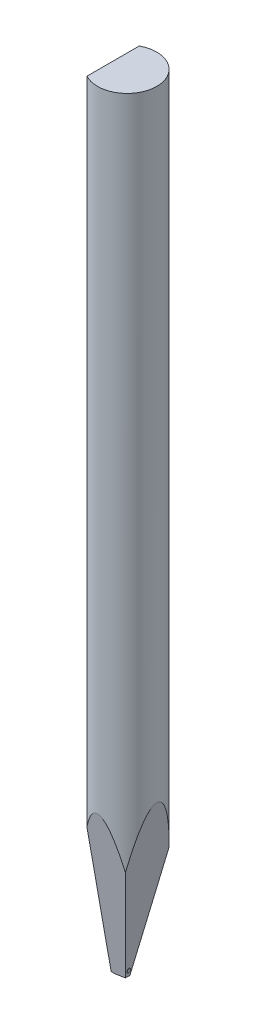
ISO-10303-21;
HEADER;
FILE_DESCRIPTION(('STEP AP214'),'2;1');
FILE_NAME('part.step','',(''),(''),'','','');
FILE_SCHEMA(('AUTOMOTIVE_DESIGN { 1 0 10303 214 1 1 1 1 }'));
ENDSEC;
DATA;
#1=APPLICATION_CONTEXT('core data for automotive mechanical design processes');
#2=APPLICATION_PROTOCOL_DEFINITION('international standard','automotive_design',2000,#1);
#3=PRODUCT_CONTEXT('',#1,'mechanical');
#4=PRODUCT('Part','Part','',(#3));
#5=PRODUCT_RELATED_PRODUCT_CATEGORY('part','',(#4));
#6=PRODUCT_DEFINITION_FORMATION('','',#4);
#7=PRODUCT_DEFINITION_CONTEXT('part definition',#1,'design');
#8=PRODUCT_DEFINITION('design','',#6,#7);
#9=PRODUCT_DEFINITION_SHAPE('','',#8);
#10=(LENGTH_UNIT() NAMED_UNIT(*) SI_UNIT(.MILLI.,.METRE.));
#11=(NAMED_UNIT(*) PLANE_ANGLE_UNIT() SI_UNIT($,.RADIAN.));
#12=(NAMED_UNIT(*) SI_UNIT($,.STERADIAN.) SOLID_ANGLE_UNIT());
#13=UNCERTAINTY_MEASURE_WITH_UNIT(LENGTH_MEASURE(1.E-05),#10,'distance_accuracy_value','');
#14=(GEOMETRIC_REPRESENTATION_CONTEXT(3) GLOBAL_UNCERTAINTY_ASSIGNED_CONTEXT((#13)) GLOBAL_UNIT_ASSIGNED_CONTEXT((#10,
#11,#12)) REPRESENTATION_CONTEXT('',''));
#15=CARTESIAN_POINT('',(0.,0.,0.));
#16=DIRECTION('',(0.,0.,1.));
#17=DIRECTION('',(1.,0.,0.));
#18=AXIS2_PLACEMENT_3D('',#15,#16,#17);
#19=CARTESIAN_POINT('',(-0.35179,0.02413,-0.697645113220181));
#20=DIRECTION('',(0.,0.,-1.));
#21=DIRECTION('',(-1.,0.,0.));
#22=AXIS2_PLACEMENT_3D('',#19,#20,#21);
#23=CYLINDRICAL_SURFACE('',#22,0.02413);
#24=DIRECTION('',(0.,0.,1.));
#25=VECTOR('',#24,1.);
#26=CARTESIAN_POINT('',(-0.35179,0.,-0.697645113220181));
#27=LINE('',#26,#25);
#28=CARTESIAN_POINT('',(-0.351790000000001,0.,-0.0355373141922684));
#29=VERTEX_POINT('',#28);
#30=CARTESIAN_POINT('',(-0.351790000000001,0.,-0.0508));
#31=VERTEX_POINT('',#30);
#32=EDGE_CURVE('E268',#29,#31,#27,.F.);
#33=ORIENTED_EDGE('',*,*,#32,.F.);
#34=CARTESIAN_POINT('',(-0.351790000000659,0.,0.0355373141922685));
#35=CARTESIAN_POINT('',(-0.355439384782997,0.,0.0355448754797007));
#36=CARTESIAN_POINT('',(-0.358294431690221,0.000735009319129566,0.0328897702512951));
#37=CARTESIAN_POINT('',(-0.363332226937785,0.00276624054883062,0.027243529224967));
#38=CARTESIAN_POINT('',(-0.365669914625181,0.00414391785908221,0.0239802570416559));
#39=CARTESIAN_POINT('',(-0.370318278213299,0.00835665489515854,0.0173280439032284));
#40=CARTESIAN_POINT('',(-0.372697992437492,0.0113759111488522,0.0139008125188561));
#41=CARTESIAN_POINT('',(-0.375773637558285,0.019170558533262,0.00698806495705653));
#42=CARTESIAN_POINT('',(-0.375919999997032,0.0241261624167635,0.00351378677860995));
#43=CARTESIAN_POINT('',(-0.375920000002953,0.0241338001705575,-0.00344714356347953));
#44=CARTESIAN_POINT('',(-0.375775830039886,0.0191733950297102,-0.00697985321022779));
#45=CARTESIAN_POINT('',(-0.372691584248382,0.0113623944515196,-0.0139527446694006));
#46=CARTESIAN_POINT('',(-0.370302827351457,0.00833894476345204,-0.017392282784283));
#47=CARTESIAN_POINT('',(-0.36565390830275,0.0041331440320866,-0.024020652659714));
#48=CARTESIAN_POINT('',(-0.363329174051964,0.00276466571011306,-0.0272501183872912));
#49=CARTESIAN_POINT('',(-0.358292223960195,0.000734463445101154,-0.0328915850521503));
#50=CARTESIAN_POINT('',(-0.35541937367538,0.,-0.0355460604902777));
#51=CARTESIAN_POINT('',(-0.35179,0.,-0.0355373141922684));
#52=(BOUNDED_CURVE() B_SPLINE_CURVE(3,(#34,#35,#36,#37,#38,#39,#40,#41,#42,#43,#44,#45,#46,#47,
#48,#49,#50,#51),.UNSPECIFIED.,.F.,.F.) B_SPLINE_CURVE_WITH_KNOTS((4,2,2,2,2,2,2,2,4),(0.,
1.01740372471117E-05,2.03480744942226E-05,3.05221117413334E-05,4.06961489884443E-05,
5.08701862355551E-05,6.1044223482666E-05,7.12182607297768E-05,8.13922979768877E-05),
.UNSPECIFIED.) CURVE() GEOMETRIC_REPRESENTATION_ITEM() RATIONAL_B_SPLINE_CURVE((1.,1.,1.,1.,1.,
1.,1.,1.,1.,1.,1.,1.,1.,1.,1.,1.,1.,1.)) REPRESENTATION_ITEM(''));
#53=CARTESIAN_POINT('',(-0.37592,0.02413,2.93448059982297E-05));
#54=VERTEX_POINT('',#53);
#55=EDGE_CURVE('E60',#29,#54,#52,.F.);
#56=ORIENTED_EDGE('',*,*,#55,.T.);
#57=DIRECTION('',(0.,0.,1.));
#58=VECTOR('',#57,1.);
#59=CARTESIAN_POINT('',(-0.37592,0.02413,-0.697645113220181));
#60=LINE('',#59,#58);
#61=CARTESIAN_POINT('',(-0.37592,0.02413,-0.0550547700444953));
#62=VERTEX_POINT('',#61);
#63=EDGE_CURVE('E265',#62,#54,#60,.T.);
#64=ORIENTED_EDGE('',*,*,#63,.F.);
#65=CARTESIAN_POINT('',(-0.35179,0.02413,-0.0550547700444953));
#66=DIRECTION('',(0.,0.173648177666931,0.984807753012208));
#67=DIRECTION('',(0.,0.984807753012208,-0.173648177666931));
#68=AXIS2_PLACEMENT_3D('',#65,#66,#67);
#69=ELLIPSE('',#68,0.024502244144803,0.02413);
#70=EDGE_CURVE('E400',#31,#62,#69,.F.);
#71=ORIENTED_EDGE('',*,*,#70,.F.);
#72=EDGE_LOOP('',(#33,#56,#64,#71));
#73=FACE_BOUND('',#72,.T.);
#74=ADVANCED_FACE('F46',(#73),#23,.T.);
#75=CARTESIAN_POINT('',(0.,0.,0.));
#76=DIRECTION('',(0.,1.,0.));
#77=DIRECTION('',(0.,0.,1.));
#78=AXIS2_PLACEMENT_3D('',#75,#76,#77);
#79=PLANE('',#78);
#80=DIRECTION('',(-1.,0.,0.));
#81=VECTOR('',#80,1.);
#82=CARTESIAN_POINT('',(26.8738719491216,0.,0.0355373141922684));
#83=LINE('',#82,#81);
#84=CARTESIAN_POINT('',(-0.279400000000003,0.,0.0355373141922684));
#85=VERTEX_POINT('',#84);
#86=CARTESIAN_POINT('',(-0.35179000000066,0.,0.0355373141922684));
#87=VERTEX_POINT('',#86);
#88=EDGE_CURVE('E176',#85,#87,#83,.T.);
#89=ORIENTED_EDGE('',*,*,#88,.F.);
#90=DIRECTION('',(0.,0.,-1.));
#91=VECTOR('',#90,1.);
#92=CARTESIAN_POINT('',(-0.2794,0.,26.4674719491216));
#93=LINE('',#92,#91);
#94=CARTESIAN_POINT('',(-0.279399999999996,0.,0.0507999999999966));
#95=VERTEX_POINT('',#94);
#96=EDGE_CURVE('E192',#95,#85,#93,.T.);
#97=ORIENTED_EDGE('',*,*,#96,.F.);
#98=DIRECTION('',(-1.,0.,0.));
#99=VECTOR('',#98,1.);
#100=CARTESIAN_POINT('',(26.8738719491216,0.,0.0508));
#101=LINE('',#100,#99);
#102=CARTESIAN_POINT('',(-0.351790000000001,0.,0.0508));
#103=VERTEX_POINT('',#102);
#104=EDGE_CURVE('E220',#95,#103,#101,.T.);
#105=ORIENTED_EDGE('',*,*,#104,.T.);
#106=EDGE_CURVE('E304',#103,#87,#27,.F.);
#107=ORIENTED_EDGE('',*,*,#106,.T.);
#108=EDGE_LOOP('',(#89,#97,#105,#107));
#109=FACE_BOUND('',#108,.T.);
#110=ADVANCED_FACE('F287',(#109),#79,.F.);
#111=CARTESIAN_POINT('',(-0.37592,0.0241299999999999,0.0550547700444952));
#112=VERTEX_POINT('',#111);
#113=EDGE_CURVE('E255',#54,#112,#60,.T.);
#114=ORIENTED_EDGE('',*,*,#113,.F.);
#115=CARTESIAN_POINT('',(-0.351790000000659,0.,0.0355373141922685));
#116=CARTESIAN_POINT('',(-0.355439384782997,0.,0.0355448754797007));
#117=CARTESIAN_POINT('',(-0.358294431690221,0.000735009319129566,0.0328897702512951));
#118=CARTESIAN_POINT('',(-0.363332226937785,0.00276624054883062,0.027243529224967));
#119=CARTESIAN_POINT('',(-0.365669914625181,0.00414391785908221,0.0239802570416559));
#120=CARTESIAN_POINT('',(-0.370318278213299,0.00835665489515854,0.0173280439032284));
#121=CARTESIAN_POINT('',(-0.372697992437492,0.0113759111488522,0.0139008125188561));
#122=CARTESIAN_POINT('',(-0.375773637558285,0.019170558533262,0.00698806495705653));
#123=CARTESIAN_POINT('',(-0.375919999997032,0.0241261624167635,0.00351378677860995));
#124=CARTESIAN_POINT('',(-0.375920000002953,0.0241338001705575,-0.00344714356347953));
#125=CARTESIAN_POINT('',(-0.375775830039886,0.0191733950297102,-0.00697985321022779));
#126=CARTESIAN_POINT('',(-0.372691584248382,0.0113623944515196,-0.0139527446694006));
#127=CARTESIAN_POINT('',(-0.370302827351457,0.00833894476345204,-0.017392282784283));
#128=CARTESIAN_POINT('',(-0.36565390830275,0.0041331440320866,-0.024020652659714));
#129=CARTESIAN_POINT('',(-0.363329174051964,0.00276466571011306,-0.0272501183872912));
#130=CARTESIAN_POINT('',(-0.358292223960195,0.000734463445101154,-0.0328915850521503));
#131=CARTESIAN_POINT('',(-0.35541937367538,0.,-0.0355460604902777));
#132=CARTESIAN_POINT('',(-0.35179,0.,-0.0355373141922684));
#133=(BOUNDED_CURVE() B_SPLINE_CURVE(3,(#115,#116,#117,#118,#119,#120,#121,#122,#123,#124,#125,
#126,#127,#128,#129,#130,#131,#132),.UNSPECIFIED.,.F.,.F.) B_SPLINE_CURVE_WITH_KNOTS((4,2,2,2,2,
2,2,2,4),(0.,1.01740372471117E-05,2.03480744942226E-05,3.05221117413334E-05,
4.06961489884443E-05,5.08701862355551E-05,6.1044223482666E-05,7.12182607297768E-05,
8.13922979768877E-05),
.UNSPECIFIED.) CURVE() GEOMETRIC_REPRESENTATION_ITEM() RATIONAL_B_SPLINE_CURVE((1.,1.,1.,1.,1.,
1.,1.,1.,1.,1.,1.,1.,1.,1.,1.,1.,1.,1.)) REPRESENTATION_ITEM(''));
#134=EDGE_CURVE('E67',#54,#87,#133,.F.);
#135=ORIENTED_EDGE('',*,*,#134,.T.);
#136=ORIENTED_EDGE('',*,*,#106,.F.);
#137=CARTESIAN_POINT('',(-0.35179,0.02413,0.0550547700444953));
#138=DIRECTION('',(0.,0.173648177666931,-0.984807753012208));
#139=DIRECTION('',(0.,-0.984807753012208,-0.173648177666931));
#140=AXIS2_PLACEMENT_3D('',#137,#138,#139);
#141=ELLIPSE('',#140,0.024502244144803,0.02413);
#142=EDGE_CURVE('E420',#112,#103,#141,.F.);
#143=ORIENTED_EDGE('',*,*,#142,.F.);
#144=EDGE_LOOP('',(#114,#135,#136,#143));
#145=FACE_BOUND('',#144,.T.);
#146=ADVANCED_FACE('F277',(#145),#23,.T.);
#147=CARTESIAN_POINT('',(0.,0.,0.02286));
#148=DIRECTION('',(0.,0.,-1.));
#149=DIRECTION('',(-1.,0.,0.));
#150=AXIS2_PLACEMENT_3D('',#147,#148,#149);
#151=PLANE('',#150);
#152=DIRECTION('',(-0.984807753012208,-0.173648177666931,0.));
#153=VECTOR('',#152,1.);
#154=CARTESIAN_POINT('',(-0.2794,0.,0.0228599999999995));
#155=LINE('',#154,#153);
#156=CARTESIAN_POINT('',(-0.1143,0.0291115845149677,0.0228599999999998));
#157=VERTEX_POINT('',#156);
#158=CARTESIAN_POINT('',(-0.2666733614567,0.00224404974890385,0.0228599999999998));
#159=VERTEX_POINT('',#158);
#160=EDGE_CURVE('E253',#157,#159,#155,.T.);
#161=ORIENTED_EDGE('',*,*,#160,.T.);
#162=DIRECTION('',(-1.,0.,0.));
#163=VECTOR('',#162,1.);
#164=CARTESIAN_POINT('',(26.8738719491216,0.00224404974889968,0.02286));
#165=LINE('',#164,#163);
#166=CARTESIAN_POINT('',(-0.303504397273399,0.00224404974889912,0.02286));
#167=VERTEX_POINT('',#166);
#168=EDGE_CURVE('E390',#159,#167,#165,.T.);
#169=ORIENTED_EDGE('',*,*,#168,.T.);
#170=DIRECTION('',(-0.499999999999998,-0.86602540378444,0.));
#171=VECTOR('',#170,1.);
#172=CARTESIAN_POINT('',(-0.3048,0.,0.02286));
#173=LINE('',#172,#171);
#174=CARTESIAN_POINT('',(-0.25054062170156,0.09398,0.02286));
#175=VERTEX_POINT('',#174);
#176=EDGE_CURVE('E384',#175,#167,#173,.T.);
#177=ORIENTED_EDGE('',*,*,#176,.F.);
#178=DIRECTION('',(-1.,0.,0.));
#179=VECTOR('',#178,1.);
#180=CARTESIAN_POINT('',(-0.25054062170156,0.09398,0.02286));
#181=LINE('',#180,#179);
#182=CARTESIAN_POINT('',(-0.121701865104678,0.09398,0.02286));
#183=VERTEX_POINT('',#182);
#184=EDGE_CURVE('E375',#183,#175,#181,.T.);
#185=ORIENTED_EDGE('',*,*,#184,.F.);
#186=CARTESIAN_POINT('',(-0.1143,0.09398,0.02286));
#187=VERTEX_POINT('',#186);
#188=EDGE_CURVE('E387',#187,#183,#181,.T.);
#189=ORIENTED_EDGE('',*,*,#188,.F.);
#190=DIRECTION('',(0.,1.,0.));
#191=VECTOR('',#190,1.);
#192=CARTESIAN_POINT('',(-0.1143,0.09398,0.02286));
#193=LINE('',#192,#191);
#194=EDGE_CURVE('E382',#157,#187,#193,.T.);
#195=ORIENTED_EDGE('',*,*,#194,.F.);
#196=EDGE_LOOP('',(#161,#169,#177,#185,#189,#195));
#197=FACE_BOUND('',#196,.T.);
#198=ADVANCED_FACE('F286',(#197),#151,.T.);
#199=CARTESIAN_POINT('',(0.,0.,-0.02286));
#200=DIRECTION('',(0.,0.,-1.));
#201=DIRECTION('',(-1.,0.,0.));
#202=AXIS2_PLACEMENT_3D('',#199,#200,#201);
#203=PLANE('',#202);
#204=DIRECTION('',(-1.,0.,0.));
#205=VECTOR('',#204,1.);
#206=CARTESIAN_POINT('',(26.8738719491216,0.00224404974889968,-0.02286));
#207=LINE('',#206,#205);
#208=CARTESIAN_POINT('',(-0.2666733614567,0.00224404974890385,-0.0228599999999998));
#209=VERTEX_POINT('',#208);
#210=CARTESIAN_POINT('',(-0.303504397273399,0.00224404974889912,-0.02286));
#211=VERTEX_POINT('',#210);
#212=EDGE_CURVE('E76',#209,#211,#207,.T.);
#213=ORIENTED_EDGE('',*,*,#212,.F.);
#214=DIRECTION('',(-0.984807753012208,-0.173648177666931,0.));
#215=VECTOR('',#214,1.);
#216=CARTESIAN_POINT('',(-0.2794,0.,-0.0228599999999995));
#217=LINE('',#216,#215);
#218=CARTESIAN_POINT('',(-0.1143,0.0291115845149677,-0.0228599999999998));
#219=VERTEX_POINT('',#218);
#220=EDGE_CURVE('E184',#219,#209,#217,.T.);
#221=ORIENTED_EDGE('',*,*,#220,.F.);
#222=DIRECTION('',(0.,1.,0.));
#223=VECTOR('',#222,1.);
#224=CARTESIAN_POINT('',(-0.1143,0.09398,-0.02286));
#225=LINE('',#224,#223);
#226=CARTESIAN_POINT('',(-0.1143,0.09398,-0.02286));
#227=VERTEX_POINT('',#226);
#228=EDGE_CURVE('E373',#219,#227,#225,.T.);
#229=ORIENTED_EDGE('',*,*,#228,.T.);
#230=DIRECTION('',(-1.,0.,0.));
#231=VECTOR('',#230,1.);
#232=CARTESIAN_POINT('',(-0.25054062170156,0.09398,-0.02286));
#233=LINE('',#232,#231);
#234=CARTESIAN_POINT('',(-0.121701865104678,0.09398,-0.02286));
#235=VERTEX_POINT('',#234);
#236=EDGE_CURVE('E379',#227,#235,#233,.T.);
#237=ORIENTED_EDGE('',*,*,#236,.T.);
#238=CARTESIAN_POINT('',(-0.25054062170156,0.09398,-0.02286));
#239=VERTEX_POINT('',#238);
#240=EDGE_CURVE('E185',#235,#239,#233,.T.);
#241=ORIENTED_EDGE('',*,*,#240,.T.);
#242=DIRECTION('',(-0.499999999999998,-0.86602540378444,0.));
#243=VECTOR('',#242,1.);
#244=CARTESIAN_POINT('',(-0.3048,0.,-0.02286));
#245=LINE('',#244,#243);
#246=EDGE_CURVE('E376',#239,#211,#245,.T.);
#247=ORIENTED_EDGE('',*,*,#246,.T.);
#248=EDGE_LOOP('',(#213,#221,#229,#237,#241,#247));
#249=FACE_BOUND('',#248,.T.);
#250=ADVANCED_FACE('F327',(#249),#203,.F.);
#251=CARTESIAN_POINT('',(-0.279400000000003,0.,-0.0355373141922684));
#252=VERTEX_POINT('',#251);
#253=CARTESIAN_POINT('',(-0.279399999999996,0.,-0.0508000000000019));
#254=VERTEX_POINT('',#253);
#255=EDGE_CURVE('E181',#252,#254,#93,.T.);
#256=ORIENTED_EDGE('',*,*,#255,.F.);
#257=DIRECTION('',(-1.,0.,0.));
#258=VECTOR('',#257,1.);
#259=CARTESIAN_POINT('',(26.8738719491216,0.,-0.0355373141922684));
#260=LINE('',#259,#258);
#261=EDGE_CURVE('E167',#252,#29,#260,.T.);
#262=ORIENTED_EDGE('',*,*,#261,.T.);
#263=ORIENTED_EDGE('',*,*,#32,.T.);
#264=DIRECTION('',(-1.,0.,0.));
#265=VECTOR('',#264,1.);
#266=CARTESIAN_POINT('',(26.8738719491216,0.,-0.0508));
#267=LINE('',#266,#265);
#268=EDGE_CURVE('E191',#254,#31,#267,.T.);
#269=ORIENTED_EDGE('',*,*,#268,.F.);
#270=EDGE_LOOP('',(#256,#262,#263,#269));
#271=FACE_BOUND('',#270,.T.);
#272=ADVANCED_FACE('F189',(#271),#79,.F.);
#273=CARTESIAN_POINT('',(-0.2794,0.,26.4674719491216));
#274=DIRECTION('',(-0.173648177666931,0.984807753012208,0.));
#275=DIRECTION('',(-0.984807753012208,-0.173648177666931,0.));
#276=AXIS2_PLACEMENT_3D('',#273,#274,#275);
#277=PLANE('',#276);
#278=CARTESIAN_POINT('',(-1.20852610050796,-0.16383,0.));
#279=DIRECTION('',(-0.173648177666931,0.984807753012208,0.));
#280=DIRECTION('',(-0.984807753012208,-0.173648177666931,0.));
#281=AXIS2_PLACEMENT_3D('',#278,#279,#280);
#282=ELLIPSE('',#281,0.965400283794194,0.16764);
#283=EDGE_CURVE('E171',#252,#209,#282,.F.);
#284=ORIENTED_EDGE('',*,*,#283,.F.);
#285=ORIENTED_EDGE('',*,*,#255,.T.);
#286=DIRECTION('',(-0.984346441568213,-0.173566836012845,0.0306045161452665));
#287=VECTOR('',#286,1.);
#288=CARTESIAN_POINT('',(26.0304347628768,4.6391337266767,-0.868804443127717));
#289=LINE('',#288,#287);
#290=CARTESIAN_POINT('',(0.014208646356975,0.051771126122025,-0.0599286463569765));
#291=VERTEX_POINT('',#290);
#292=EDGE_CURVE('E211',#291,#254,#289,.T.);
#293=ORIENTED_EDGE('',*,*,#292,.F.);
#294=DIRECTION('',(0.,0.,-1.));
#295=VECTOR('',#294,1.);
#296=CARTESIAN_POINT('',(0.0142086463569735,0.0517711261220249,26.4674719491216));
#297=LINE('',#296,#295);
#298=CARTESIAN_POINT('',(0.0142086463569766,0.0517711261220251,0.0599286463569738));
#299=VERTEX_POINT('',#298);
#300=EDGE_CURVE('E196',#299,#291,#297,.T.);
#301=ORIENTED_EDGE('',*,*,#300,.F.);
#302=DIRECTION('',(0.984346441568213,0.173566836012845,0.0306045161452664));
#303=VECTOR('',#302,1.);
#304=CARTESIAN_POINT('',(26.0304347628768,4.6391337266767,0.868804443127716));
#305=LINE('',#304,#303);
#306=EDGE_CURVE('E244',#95,#299,#305,.T.);
#307=ORIENTED_EDGE('',*,*,#306,.F.);
#308=ORIENTED_EDGE('',*,*,#96,.T.);
#309=EDGE_CURVE('E186',#159,#85,#282,.F.);
#310=ORIENTED_EDGE('',*,*,#309,.F.);
#311=ORIENTED_EDGE('',*,*,#160,.F.);
#312=DIRECTION('',(0.,0.,1.));
#313=VECTOR('',#312,1.);
#314=CARTESIAN_POINT('',(-0.1143,0.0291115845149677,26.4674719491216));
#315=LINE('',#314,#313);
#316=EDGE_CURVE('E251',#219,#157,#315,.T.);
#317=ORIENTED_EDGE('',*,*,#316,.F.);
#318=ORIENTED_EDGE('',*,*,#220,.T.);
#319=EDGE_LOOP('',(#284,#285,#293,#301,#307,#308,#310,#311,#317,#318));
#320=FACE_BOUND('',#319,.T.);
#321=ADVANCED_FACE('F180',(#320),#277,.F.);
#322=CARTESIAN_POINT('',(0.,21.0312,0.));
#323=DIRECTION('',(0.,1.,0.));
#324=DIRECTION('',(0.,0.,1.));
#325=AXIS2_PLACEMENT_3D('',#322,#323,#324);
#326=PLANE('',#325);
#327=CARTESIAN_POINT('',(0.,21.0312,0.));
#328=DIRECTION('',(0.,1.,0.));
#329=DIRECTION('',(0.,0.,1.));
#330=AXIS2_PLACEMENT_3D('',#327,#328,#329);
#331=CIRCLE('',#330,0.79248);
#332=CARTESIAN_POINT('',(-0.37592,21.0312,0.697645113220181));
#333=VERTEX_POINT('',#332);
#334=CARTESIAN_POINT('',(-0.37592,21.0312,-0.697645113220181));
#335=VERTEX_POINT('',#334);
#336=EDGE_CURVE('E232',#333,#335,#331,.T.);
#337=ORIENTED_EDGE('',*,*,#336,.T.);
#338=DIRECTION('',(0.,0.,1.));
#339=VECTOR('',#338,1.);
#340=CARTESIAN_POINT('',(-0.37592,21.0312,0.));
#341=LINE('',#340,#339);
#342=EDGE_CURVE('E236',#335,#333,#341,.T.);
#343=ORIENTED_EDGE('',*,*,#342,.T.);
#344=EDGE_LOOP('',(#337,#343));
#345=FACE_BOUND('',#344,.T.);
#346=ADVANCED_FACE('F441',(#345),#326,.T.);
#347=CARTESIAN_POINT('',(0.,21.0312,0.));
#348=DIRECTION('',(0.,-1.,0.));
#349=DIRECTION('',(0.,0.,-1.));
#350=AXIS2_PLACEMENT_3D('',#347,#348,#349);
#351=CYLINDRICAL_SURFACE('',#350,0.79248);
#352=CARTESIAN_POINT('',(0.,-0.288101116436578,0.));
#353=DIRECTION('',(0.,0.173648177666931,-0.984807753012208));
#354=DIRECTION('',(0.,-0.984807753012208,-0.173648177666931));
#355=AXIS2_PLACEMENT_3D('',#352,#353,#354);
#356=ELLIPSE('',#355,4.56371043248165,0.79248);
#357=CARTESIAN_POINT('',(-0.37592,3.66844093071416,0.697645113220181));
#358=VERTEX_POINT('',#357);
#359=CARTESIAN_POINT('',(0.537041505266775,3.01690361355591,0.582761505266773));
#360=VERTEX_POINT('',#359);
#361=EDGE_CURVE('E226',#358,#360,#356,.T.);
#362=ORIENTED_EDGE('',*,*,#361,.T.);
#363=CARTESIAN_POINT('',(0.,-0.0288101116436568,0.));
#364=DIRECTION('',(-0.984807753012208,0.173648177666931,0.));
#365=DIRECTION('',(-0.173648177666931,-0.984807753012208,0.));
#366=AXIS2_PLACEMENT_3D('',#363,#364,#365);
#367=ELLIPSE('',#366,4.56371043248166,0.79248);
#368=CARTESIAN_POINT('',(0.537041505266774,3.01690361355592,-0.582761505266776));
#369=VERTEX_POINT('',#368);
#370=EDGE_CURVE('E213',#360,#369,#367,.T.);
#371=ORIENTED_EDGE('',*,*,#370,.T.);
#372=CARTESIAN_POINT('',(0.,-0.288101116436578,0.));
#373=DIRECTION('',(0.,0.173648177666931,0.984807753012208));
#374=DIRECTION('',(0.,-0.984807753012208,0.173648177666931));
#375=AXIS2_PLACEMENT_3D('',#372,#373,#374);
#376=ELLIPSE('',#375,4.56371043248164,0.79248);
#377=CARTESIAN_POINT('',(-0.37592,3.66844093071416,-0.697645113220182));
#378=VERTEX_POINT('',#377);
#379=EDGE_CURVE('E223',#369,#378,#376,.T.);
#380=ORIENTED_EDGE('',*,*,#379,.T.);
#381=DIRECTION('',(0.,1.,0.));
#382=VECTOR('',#381,1.);
#383=CARTESIAN_POINT('',(-0.37592,0.,-0.697645113220181));
#384=LINE('',#383,#382);
#385=EDGE_CURVE('E229',#378,#335,#384,.T.);
#386=ORIENTED_EDGE('',*,*,#385,.T.);
#387=ORIENTED_EDGE('',*,*,#336,.F.);
#388=DIRECTION('',(0.,1.,0.));
#389=VECTOR('',#388,1.);
#390=CARTESIAN_POINT('',(-0.37592,0.,0.697645113220181));
#391=LINE('',#390,#389);
#392=EDGE_CURVE('E230',#358,#333,#391,.T.);
#393=ORIENTED_EDGE('',*,*,#392,.F.);
#394=EDGE_LOOP('',(#362,#371,#380,#386,#387,#393));
#395=FACE_BOUND('',#394,.T.);
#396=ADVANCED_FACE('F288',(#395),#351,.T.);
#397=CARTESIAN_POINT('',(-0.37592,0.,-0.697645113220181));
#398=DIRECTION('',(-1.,0.,0.));
#399=DIRECTION('',(0.,0.,1.));
#400=AXIS2_PLACEMENT_3D('',#397,#398,#399);
#401=PLANE('',#400);
#402=DIRECTION('',(0.,0.984807753012208,-0.173648177666931));
#403=VECTOR('',#402,1.);
#404=CARTESIAN_POINT('',(-0.37592,0.110617029166538,-0.0703047667678759));
#405=LINE('',#404,#403);
#406=EDGE_CURVE('E239',#62,#378,#405,.T.);
#407=ORIENTED_EDGE('',*,*,#406,.F.);
#408=ORIENTED_EDGE('',*,*,#63,.T.);
#409=ORIENTED_EDGE('',*,*,#113,.T.);
#410=DIRECTION('',(0.,-0.984807753012208,-0.173648177666931));
#411=VECTOR('',#410,1.);
#412=CARTESIAN_POINT('',(-0.37592,-0.127991652447482,0.0282316183680482));
#413=LINE('',#412,#411);
#414=EDGE_CURVE('E241',#358,#112,#413,.T.);
#415=ORIENTED_EDGE('',*,*,#414,.F.);
#416=ORIENTED_EDGE('',*,*,#392,.T.);
#417=ORIENTED_EDGE('',*,*,#342,.F.);
#418=ORIENTED_EDGE('',*,*,#385,.F.);
#419=EDGE_LOOP('',(#407,#408,#409,#415,#416,#417,#418));
#420=FACE_BOUND('',#419,.T.);
#421=ADVANCED_FACE('F430',(#420),#401,.T.);
#422=CARTESIAN_POINT('',(26.8738719491216,0.,-0.0508));
#423=DIRECTION('',(0.,0.173648177666931,0.984807753012208));
#424=DIRECTION('',(0.,-0.984807753012208,0.173648177666931));
#425=AXIS2_PLACEMENT_3D('',#422,#423,#424);
#426=PLANE('',#425);
#427=ORIENTED_EDGE('',*,*,#268,.T.);
#428=ORIENTED_EDGE('',*,*,#70,.T.);
#429=ORIENTED_EDGE('',*,*,#406,.T.);
#430=ORIENTED_EDGE('',*,*,#379,.F.);
#431=DIRECTION('',(-0.171087869746036,-0.970287525247814,0.171087869746036));
#432=VECTOR('',#431,1.);
#433=CARTESIAN_POINT('',(0.791557999082992,4.46033837772866,-0.837277999082991));
#434=LINE('',#433,#432);
#435=EDGE_CURVE('E216',#369,#291,#434,.T.);
#436=ORIENTED_EDGE('',*,*,#435,.T.);
#437=ORIENTED_EDGE('',*,*,#292,.T.);
#438=EDGE_LOOP('',(#427,#428,#429,#430,#436,#437));
#439=FACE_BOUND('',#438,.T.);
#440=ADVANCED_FACE('F425',(#439),#426,.F.);
#441=CARTESIAN_POINT('',(26.8738719491216,0.,0.0508));
#442=DIRECTION('',(0.,0.173648177666931,-0.984807753012208));
#443=DIRECTION('',(0.,0.984807753012208,0.173648177666931));
#444=AXIS2_PLACEMENT_3D('',#441,#442,#443);
#445=PLANE('',#444);
#446=ORIENTED_EDGE('',*,*,#414,.T.);
#447=ORIENTED_EDGE('',*,*,#142,.T.);
#448=ORIENTED_EDGE('',*,*,#104,.F.);
#449=ORIENTED_EDGE('',*,*,#306,.T.);
#450=DIRECTION('',(0.171087869746036,0.970287525247814,0.171087869746036));
#451=VECTOR('',#450,1.);
#452=CARTESIAN_POINT('',(0.791557999082992,4.46033837772866,0.83727799908299));
#453=LINE('',#452,#451);
#454=EDGE_CURVE('E247',#299,#360,#453,.T.);
#455=ORIENTED_EDGE('',*,*,#454,.T.);
#456=ORIENTED_EDGE('',*,*,#361,.F.);
#457=EDGE_LOOP('',(#446,#447,#448,#449,#455,#456));
#458=FACE_BOUND('',#457,.T.);
#459=ADVANCED_FACE('F438',(#458),#445,.F.);
#460=CARTESIAN_POINT('',(0.0142086463569735,0.0517711261220249,26.4674719491216));
#461=DIRECTION('',(-0.984807753012208,0.173648177666931,0.));
#462=DIRECTION('',(-0.173648177666931,-0.984807753012208,0.));
#463=AXIS2_PLACEMENT_3D('',#460,#461,#462);
#464=PLANE('',#463);
#465=CARTESIAN_POINT('',(0.0415458555398716,0.206808143560081,0.));
#466=DIRECTION('',(-0.984807753012208,0.173648177666931,0.));
#467=DIRECTION('',(0.173648177666931,0.984807753012208,0.));
#468=AXIS2_PLACEMENT_3D('',#465,#466,#467);
#469=ELLIPSE('',#468,0.0604247772827593,0.0434022518892706);
#470=CARTESIAN_POINT('',(0.0520385080009529,0.266314932702178,0.));
#471=VERTEX_POINT('',#470);
#472=EDGE_CURVE('E193',#471,#471,#469,.F.);
#473=ORIENTED_EDGE('',*,*,#472,.F.);
#474=EDGE_LOOP('',(#473));
#475=FACE_BOUND('',#474,.T.);
#476=ORIENTED_EDGE('',*,*,#435,.F.);
#477=ORIENTED_EDGE('',*,*,#370,.F.);
#478=ORIENTED_EDGE('',*,*,#454,.F.);
#479=ORIENTED_EDGE('',*,*,#300,.T.);
#480=EDGE_LOOP('',(#476,#477,#478,#479));
#481=FACE_BOUND('',#480,.T.);
#482=ADVANCED_FACE('F323',(#475,#481),#464,.F.);
#483=CARTESIAN_POINT('',(0.000607243048287337,0.164595196516458,0.));
#484=DIRECTION('',(0.866025403784438,0.500000000000001,0.));
#485=DIRECTION('',(-0.500000000000001,0.866025403784438,0.));
#486=AXIS2_PLACEMENT_3D('',#483,#484,#485);
#487=CONICAL_SURFACE('',#486,0.02286,0.392699081698725);
#488=CARTESIAN_POINT('',(0.000607243048287337,0.164595196516458,0.));
#489=DIRECTION('',(0.866025403784438,0.500000000000001,0.));
#490=DIRECTION('',(0.,0.,1.));
#491=AXIS2_PLACEMENT_3D('',#488,#489,#490);
#492=ELLIPSE('',#491,0.02286,0.02286);
#493=CARTESIAN_POINT('',(0.000607243048287337,0.164595196516458,0.02286));
#494=VERTEX_POINT('',#493);
#495=EDGE_CURVE('E356',#494,#494,#492,.T.);
#496=ORIENTED_EDGE('',*,*,#495,.F.);
#497=EDGE_LOOP('',(#496));
#498=FACE_BOUND('',#497,.T.);
#499=ORIENTED_EDGE('',*,*,#472,.T.);
#500=EDGE_LOOP('',(#499));
#501=FACE_BOUND('',#500,.T.);
#502=ADVANCED_FACE('F319',(#498,#501),#487,.F.);
#503=CARTESIAN_POINT('',(-0.1143,0.09398,0.02286));
#504=DIRECTION('',(-1.,0.,0.));
#505=DIRECTION('',(0.,-1.,0.));
#506=AXIS2_PLACEMENT_3D('',#503,#504,#505);
#507=PLANE('',#506);
#508=ORIENTED_EDGE('',*,*,#316,.T.);
#509=ORIENTED_EDGE('',*,*,#194,.T.);
#510=DIRECTION('',(0.,0.,-1.));
#511=VECTOR('',#510,1.);
#512=CARTESIAN_POINT('',(-0.1143,0.09398,0.02286));
#513=LINE('',#512,#511);
#514=CARTESIAN_POINT('',(-0.1143,0.09398,0.0225584285410803));
#515=VERTEX_POINT('',#514);
#516=EDGE_CURVE('E369',#187,#515,#513,.T.);
#517=ORIENTED_EDGE('',*,*,#516,.T.);
#518=CARTESIAN_POINT('',(-0.1143,0.09398,-0.0225584285410803));
#519=CARTESIAN_POINT('',(-0.1143,0.0924057954271394,-0.0223350739677221));
#520=CARTESIAN_POINT('',(-0.1143,0.0908473961619635,-0.0219863559476946));
#521=CARTESIAN_POINT('',(-0.114300000000001,0.0878232222853703,-0.0210452361973471));
#522=CARTESIAN_POINT('',(-0.114300000000001,0.0863566862966871,-0.0204552694923747));
#523=CARTESIAN_POINT('',(-0.114300000000003,0.0836314249981601,-0.0190781339672695));
#524=CARTESIAN_POINT('',(-0.114300000000004,0.0823654563397033,-0.0183054228404667));
#525=CARTESIAN_POINT('',(-0.114300000000005,0.0800644708531107,-0.0166144135763871));
#526=CARTESIAN_POINT('',(-0.114300000000006,0.0790196002447955,-0.0157096007323186));
#527=CARTESIAN_POINT('',(-0.114300000000006,0.0771643066063932,-0.0138008393322427));
#528=CARTESIAN_POINT('',(-0.114300000000006,0.076342813993079,-0.0128077169978788));
#529=CARTESIAN_POINT('',(-0.114300000000004,0.0749251370212176,-0.0107591969988387));
#530=CARTESIAN_POINT('',(-0.114300000000003,0.0743183458374454,-0.00971117681562736));
#531=CARTESIAN_POINT('',(-0.114300000000003,0.0733162877692487,-0.00757886119497411));
#532=CARTESIAN_POINT('',(-0.114300000000005,0.0729122756447162,-0.00649871279172221));
#533=CARTESIAN_POINT('',(-0.114299999999998,0.0723015502545454,-0.00432171232043534));
#534=CARTESIAN_POINT('',(-0.114299999999988,0.0720889970192091,-0.00322647101600339));
#535=CARTESIAN_POINT('',(-0.114300000000025,0.0717344499917732,9.16613753545355E-05));
#536=CARTESIAN_POINT('',(-0.114300000000133,0.0718734966375595,0.00235139313016722));
#537=CARTESIAN_POINT('',(-0.114300000000133,0.0728855112869599,0.00670026012496298));
#538=CARTESIAN_POINT('',(-0.114300000000026,0.0737604387248661,0.00878892354970407));
#539=CARTESIAN_POINT('',(-0.114299999999987,0.0755276760867999,0.0116838043538417));
#540=CARTESIAN_POINT('',(-0.114299999999997,0.0762114568813563,0.0126255424063952));
#541=CARTESIAN_POINT('',(-0.114300000000004,0.0777109772225137,0.0143973821048862));
#542=CARTESIAN_POINT('',(-0.114300000000001,0.0785266707441542,0.0152275225034292));
#543=CARTESIAN_POINT('',(-0.114299999999999,0.0804881791803642,0.0169617907888548));
#544=CARTESIAN_POINT('',(-0.1143,0.0816651228791234,0.0178307580552438));
#545=CARTESIAN_POINT('',(-0.114300000000001,0.0841423892079521,0.0193643673135987));
#546=CARTESIAN_POINT('',(-0.114300000000001,0.0854426525558252,0.0200291068368618));
#547=CARTESIAN_POINT('',(-0.1143,0.0890845383164815,0.0215500056510078));
#548=CARTESIAN_POINT('',(-0.114299999999999,0.0915112965445993,0.0222081322560807));
#549=CARTESIAN_POINT('',(-0.1143,0.0939799999999999,0.0225584285410806));
#550=B_SPLINE_CURVE_WITH_KNOTS('',3,(#518,#519,#520,#521,#522,#523,#524,#525,#526,#527,#528,
#529,#530,#531,#532,#533,#534,#535,#536,#537,#538,#539,#540,#541,#542,#543,#544,#545,#546,#547,
#548,#549),.UNSPECIFIED.,.F.,.F.,(4,2,2,2,2,2,2,2,2,2,2,2,2,2,2,4),(0.,0.00476809197059732,
0.00948920096910089,0.0139182417437812,0.0180458893931114,0.0218946968980858,0.0255111846663135,
0.0289543140677513,0.0322884650381482,0.038942802745357,0.0456149152989204,0.0490953100649421,
0.0525744931146834,0.056941341200194,0.0613061005940966,0.0687631338097126),.UNSPECIFIED.);
#551=CARTESIAN_POINT('',(-0.1143,0.09398,-0.02255842854108));
#552=VERTEX_POINT('',#551);
#553=EDGE_CURVE('E198',#552,#515,#550,.T.);
#554=ORIENTED_EDGE('',*,*,#553,.F.);
#555=EDGE_CURVE('E372',#552,#227,#513,.T.);
#556=ORIENTED_EDGE('',*,*,#555,.T.);
#557=ORIENTED_EDGE('',*,*,#228,.F.);
#558=EDGE_LOOP('',(#508,#509,#517,#554,#556,#557));
#559=FACE_BOUND('',#558,.T.);
#560=ADVANCED_FACE('F322',(#559),#507,.T.);
#561=CARTESIAN_POINT('',(-0.368473003280035,-0.0484933830537734,0.));
#562=DIRECTION('',(0.866025403784438,0.500000000000001,0.));
#563=DIRECTION('',(0.,0.,1.));
#564=AXIS2_PLACEMENT_3D('',#561,#562,#563);
#565=ELLIPSE('',#564,0.02286,0.02286);
#566=DIRECTION('',(0.866025403784438,0.500000000000001,0.));
#567=VECTOR('',#566,1.);
#568=SURFACE_OF_LINEAR_EXTRUSION('',#565,#567);
#569=ORIENTED_EDGE('',*,*,#553,.T.);
#570=CARTESIAN_POINT('',(-0.1143,0.09398,0.0225584285410803));
#571=CARTESIAN_POINT('',(-0.116200605452524,0.0939800000053368,0.0227137940856086));
#572=CARTESIAN_POINT('',(-0.118105116103306,0.0939800000035387,0.0228090003395155));
#573=CARTESIAN_POINT('',(-0.121916334658613,0.0939799999964614,0.0228797121210304));
#574=CARTESIAN_POINT('',(-0.123823042526682,0.0939799999911823,0.0228552196069252));
#575=CARTESIAN_POINT('',(-0.129544354331629,0.0939799999863009,0.0226028510355692));
#576=CARTESIAN_POINT('',(-0.133353906355921,0.0939799999977075,0.0221955802386929));
#577=CARTESIAN_POINT('',(-0.13899138352998,0.0939800000010646,0.021185674461319));
#578=CARTESIAN_POINT('',(-0.140856425360032,0.0939799999998973,0.0207829703104004));
#579=CARTESIAN_POINT('',(-0.144548298003052,0.0939800000000826,0.0198285741670677));
#580=CARTESIAN_POINT('',(-0.14637512007677,0.0939800000014359,0.0192768484923402));
#581=CARTESIAN_POINT('',(-0.15054039092353,0.0939799999978668,0.0177982953823793));
#582=CARTESIAN_POINT('',(-0.152858384328396,0.0939799999908295,0.0168080409398352));
#583=CARTESIAN_POINT('',(-0.156712996653393,0.093979999983444,0.0147506354747021));
#584=CARTESIAN_POINT('',(-0.15829710558093,0.0939799999818399,0.0137689688181239));
#585=CARTESIAN_POINT('',(-0.162001383395592,0.0939799999964925,0.0109807856518751));
#586=CARTESIAN_POINT('',(-0.164018588776524,0.0939800000215987,0.00900397375603324));
#587=CARTESIAN_POINT('',(-0.166189362933785,0.0939799999887847,0.00542065898289918));
#588=CARTESIAN_POINT('',(-0.166772651945666,0.0939799999649811,0.00409312099753642));
#589=CARTESIAN_POINT('',(-0.167433567716761,0.0939799999648852,0.00129620907290429));
#590=CARTESIAN_POINT('',(-0.167508069491358,0.0939799999888852,-0.000173985257840056));
#591=CARTESIAN_POINT('',(-0.167130030129447,0.0939800000063539,-0.00289213322202223));
#592=CARTESIAN_POINT('',(-0.166727314067407,0.093980000002528,-0.00414788249804032));
#593=CARTESIAN_POINT('',(-0.165351699043243,0.0939799999963386,-0.00702324484844047));
#594=CARTESIAN_POINT('',(-0.164204129745173,0.0939799999953993,-0.00855363436764987));
#595=CARTESIAN_POINT('',(-0.160748677189967,0.0939799999965922,-0.0121541381917285));
#596=CARTESIAN_POINT('',(-0.158169203505441,0.0939800000010883,-0.0139384214002358));
#597=CARTESIAN_POINT('',(-0.152907161684261,0.0939799999989836,-0.0168098215395047));
#598=CARTESIAN_POINT('',(-0.150242677005867,0.0939799999930968,-0.017935223853778));
#599=CARTESIAN_POINT('',(-0.144788498225534,0.0939799999925047,-0.019800305198995));
#600=CARTESIAN_POINT('',(-0.141999066041202,0.093979999997777,-0.0205407535337741));
#601=CARTESIAN_POINT('',(-0.136360515577059,0.0939800000017682,-0.0217066194759313));
#602=CARTESIAN_POINT('',(-0.133511440656961,0.0939800000004917,-0.0221322582917157));
#603=CARTESIAN_POINT('',(-0.127944655469341,0.0939799999995325,-0.02268796286045));
#604=CARTESIAN_POINT('',(-0.125228418850691,0.0939799999997654,-0.0228331064139891));
#605=CARTESIAN_POINT('',(-0.119771381559813,0.0939800000002365,-0.0228799235570446));
#606=CARTESIAN_POINT('',(-0.117030562719806,0.0939800000004746,-0.022779583364952));
#607=CARTESIAN_POINT('',(-0.1143,0.09398,-0.0225584285410806));
#608=B_SPLINE_CURVE_WITH_KNOTS('',3,(#570,#571,#572,#573,#574,#575,#576,#577,#578,#579,#580,
#581,#582,#583,#584,#585,#586,#587,#588,#589,#590,#591,#592,#593,#594,#595,#596,#597,#598,#599,
#600,#601,#602,#603,#604,#605,#606,#607),.UNSPECIFIED.,.F.,.F.,(4,2,2,2,2,2,2,2,2,2,2,2,2,2,2,2,
2,2,4),(0.,0.00571789447474082,0.0114356954043292,0.0228899607132278,0.0286089045870761,
0.0343291421578373,0.041854393615289,0.0474415923081785,0.055683733176477,0.05996287743761,
0.0642682808636111,0.0681610745479673,0.0737988652867795,0.0830622926770273,0.0917134356191603,
0.10034722274392,0.108974937353762,0.117124349850535,0.125340838403206),.UNSPECIFIED.);
#609=EDGE_CURVE('E347',#515,#183,#608,.T.);
#610=ORIENTED_EDGE('',*,*,#609,.T.);
#611=EDGE_CURVE('E354',#183,#235,#608,.T.);
#612=ORIENTED_EDGE('',*,*,#611,.T.);
#613=EDGE_CURVE('E355',#235,#552,#608,.T.);
#614=ORIENTED_EDGE('',*,*,#613,.T.);
#615=EDGE_LOOP('',(#569,#610,#612,#614));
#616=FACE_BOUND('',#615,.T.);
#617=ORIENTED_EDGE('',*,*,#495,.T.);
#618=EDGE_LOOP('',(#617));
#619=FACE_BOUND('',#618,.T.);
#620=ADVANCED_FACE('F334',(#616,#619),#568,.F.);
#621=CARTESIAN_POINT('',(-0.25054062170156,0.09398,0.02286));
#622=DIRECTION('',(0.,-1.,0.));
#623=DIRECTION('',(0.,0.,-1.));
#624=AXIS2_PLACEMENT_3D('',#621,#622,#623);
#625=PLANE('',#624);
#626=ORIENTED_EDGE('',*,*,#516,.F.);
#627=ORIENTED_EDGE('',*,*,#188,.T.);
#628=ORIENTED_EDGE('',*,*,#609,.F.);
#629=EDGE_LOOP('',(#626,#627,#628));
#630=FACE_BOUND('',#629,.T.);
#631=ADVANCED_FACE('F340',(#630),#625,.T.);
#632=ORIENTED_EDGE('',*,*,#184,.T.);
#633=DIRECTION('',(0.,0.,-1.));
#634=VECTOR('',#633,1.);
#635=CARTESIAN_POINT('',(-0.25054062170156,0.09398,0.02286));
#636=LINE('',#635,#634);
#637=EDGE_CURVE('E366',#175,#239,#636,.T.);
#638=ORIENTED_EDGE('',*,*,#637,.T.);
#639=ORIENTED_EDGE('',*,*,#240,.F.);
#640=ORIENTED_EDGE('',*,*,#611,.F.);
#641=EDGE_LOOP('',(#632,#638,#639,#640));
#642=FACE_BOUND('',#641,.T.);
#643=ADVANCED_FACE('F343',(#642),#625,.T.);
#644=ORIENTED_EDGE('',*,*,#236,.F.);
#645=ORIENTED_EDGE('',*,*,#555,.F.);
#646=ORIENTED_EDGE('',*,*,#613,.F.);
#647=EDGE_LOOP('',(#644,#645,#646));
#648=FACE_BOUND('',#647,.T.);
#649=ADVANCED_FACE('F338',(#648),#625,.T.);
#650=CARTESIAN_POINT('',(-0.3048,0.,0.02286));
#651=DIRECTION('',(0.86602540378444,-0.499999999999998,0.));
#652=DIRECTION('',(0.499999999999998,0.86602540378444,0.));
#653=AXIS2_PLACEMENT_3D('',#650,#651,#652);
#654=PLANE('',#653);
#655=ORIENTED_EDGE('',*,*,#176,.T.);
#656=CARTESIAN_POINT('',(-0.399387294601337,-0.16383,0.));
#657=DIRECTION('',(0.86602540378444,-0.499999999999998,0.));
#658=DIRECTION('',(-0.499999999999998,-0.86602540378444,0.));
#659=AXIS2_PLACEMENT_3D('',#656,#657,#658);
#660=ELLIPSE('',#659,0.193573998253897,0.16764);
#661=EDGE_CURVE('E419',#167,#211,#660,.F.);
#662=ORIENTED_EDGE('',*,*,#661,.T.);
#663=ORIENTED_EDGE('',*,*,#246,.F.);
#664=ORIENTED_EDGE('',*,*,#637,.F.);
#665=EDGE_LOOP('',(#655,#662,#663,#664));
#666=FACE_BOUND('',#665,.T.);
#667=ADVANCED_FACE('F318',(#666),#654,.T.);
#668=CARTESIAN_POINT('',(26.8738719491216,-0.16383,0.));
#669=DIRECTION('',(-1.,0.,0.));
#670=DIRECTION('',(0.,0.,1.));
#671=AXIS2_PLACEMENT_3D('',#668,#669,#670);
#672=CYLINDRICAL_SURFACE('',#671,0.16764);
#673=ORIENTED_EDGE('',*,*,#88,.T.);
#674=CARTESIAN_POINT('',(-0.35179,0.,-0.0355373141922684));
#675=CARTESIAN_POINT('',(-0.355393190050593,0.000121036277160338,-0.0349793267996395));
#676=CARTESIAN_POINT('',(-0.357170293207482,0.000780431057424491,-0.0318814396218516));
#677=CARTESIAN_POINT('',(-0.358872514757935,0.00185842900954433,-0.0256975620949133));
#678=CARTESIAN_POINT('',(-0.358904579502406,0.00234268628776179,-0.0223735244076685));
#679=CARTESIAN_POINT('',(-0.358307730610982,0.00309091920031556,-0.0158538006747011));
#680=CARTESIAN_POINT('',(-0.357634041500354,0.00336512512468978,-0.0126174889351517));
#681=CARTESIAN_POINT('',(-0.356281876705264,0.00372486515750449,-0.00622720278614806));
#682=CARTESIAN_POINT('',(-0.35560000350922,0.00381054773341067,-0.00307478632583395));
#683=CARTESIAN_POINT('',(-0.355599996490775,0.00380944699794751,0.00313422486905802));
#684=CARTESIAN_POINT('',(-0.356281309596309,0.00372406784785917,0.00623470767997273));
#685=CARTESIAN_POINT('',(-0.357635578447651,0.00336813585444153,0.0125706244482673));
#686=CARTESIAN_POINT('',(-0.358313021441122,0.00309669945487409,0.0157950012641039));
#687=CARTESIAN_POINT('',(-0.358912533073641,0.00234797646878982,0.0223357380126385));
#688=CARTESIAN_POINT('',(-0.358874205470167,0.00185943607324705,0.0256913393332979));
#689=CARTESIAN_POINT('',(-0.357172236219558,0.000780826498529391,0.0318796164104968));
#690=CARTESIAN_POINT('',(-0.35541243590133,0.00012173565869223,0.0349761025920996));
#691=CARTESIAN_POINT('',(-0.351790000000659,0.,0.0355373141922685));
#692=(BOUNDED_CURVE() B_SPLINE_CURVE(3,(#674,#675,#676,#677,#678,#679,#680,#681,#682,#683,#684,
#685,#686,#687,#688,#689,#690,#691),.UNSPECIFIED.,.F.,.F.) B_SPLINE_CURVE_WITH_KNOTS((4,2,2,2,2,
2,2,2,4),(0.,1.01740372471117E-05,2.03480744942226E-05,3.05221117413334E-05,
4.06961489884443E-05,5.08701862355551E-05,6.1044223482666E-05,7.12182607297768E-05,
8.13922979768877E-05),
.UNSPECIFIED.) CURVE() GEOMETRIC_REPRESENTATION_ITEM() RATIONAL_B_SPLINE_CURVE((1.,1.,1.,1.,1.,
1.,1.,1.,1.,1.,1.,1.,1.,1.,1.,1.,1.,1.)) REPRESENTATION_ITEM(''));
#693=EDGE_CURVE('E12',#87,#29,#692,.F.);
#694=ORIENTED_EDGE('',*,*,#693,.T.);
#695=ORIENTED_EDGE('',*,*,#261,.F.);
#696=ORIENTED_EDGE('',*,*,#283,.T.);
#697=ORIENTED_EDGE('',*,*,#212,.T.);
#698=ORIENTED_EDGE('',*,*,#661,.F.);
#699=ORIENTED_EDGE('',*,*,#168,.F.);
#700=ORIENTED_EDGE('',*,*,#309,.T.);
#701=EDGE_LOOP('',(#673,#694,#695,#696,#697,#698,#699,#700));
#702=FACE_BOUND('',#701,.T.);
#703=ADVANCED_FACE('F170',(#702),#672,.F.);
#704=CARTESIAN_POINT('',(-0.35179,0.,-0.0355373141922684));
#705=CARTESIAN_POINT('',(-0.35541937367538,0.,-0.0355460604902777));
#706=CARTESIAN_POINT('',(-0.358292223960195,0.000734463445101154,-0.0328915850521503));
#707=CARTESIAN_POINT('',(-0.363329174051964,0.00276466571011306,-0.0272501183872912));
#708=CARTESIAN_POINT('',(-0.36565390830275,0.0041331440320866,-0.024020652659714));
#709=CARTESIAN_POINT('',(-0.370302827351457,0.00833894476345204,-0.017392282784283));
#710=CARTESIAN_POINT('',(-0.372691584248382,0.0113623944515196,-0.0139527446694006));
#711=CARTESIAN_POINT('',(-0.375775830039886,0.0191733950297102,-0.00697985321022779));
#712=CARTESIAN_POINT('',(-0.375920000002953,0.0241338001705575,-0.00344714356347953));
#713=CARTESIAN_POINT('',(-0.375919999997032,0.0241261624167635,0.00351378677860995));
#714=CARTESIAN_POINT('',(-0.375773637558285,0.019170558533262,0.00698806495705653));
#715=CARTESIAN_POINT('',(-0.372697992437492,0.0113759111488522,0.0139008125188561));
#716=CARTESIAN_POINT('',(-0.370318278213299,0.00835665489515854,0.0173280439032284));
#717=CARTESIAN_POINT('',(-0.365669914625181,0.00414391785908221,0.0239802570416559));
#718=CARTESIAN_POINT('',(-0.363332226937785,0.00276624054883062,0.027243529224967));
#719=CARTESIAN_POINT('',(-0.358294431690221,0.000735009319129566,0.0328897702512951));
#720=CARTESIAN_POINT('',(-0.355439384782997,0.,0.0355448754797007));
#721=CARTESIAN_POINT('',(-0.351790000000659,0.,0.0355373141922685));
#722=CARTESIAN_POINT('',(-0.35179,0.,-0.0355373141922684));
#723=CARTESIAN_POINT('',(-0.355411006882928,6.82046643641366E-05,-0.0352615470534432));
#724=CARTESIAN_POINT('',(-0.357744177952554,0.0006876551697375,-0.0323475973160411));
#725=CARTESIAN_POINT('',(-0.361248899221111,0.00174856468116706,-0.0263951797118015));
#726=CARTESIAN_POINT('',(-0.36256097870407,0.00225342831287875,-0.023037540693484));
#727=CARTESIAN_POINT('',(-0.365516613587338,0.00304444867340338,-0.0163781604337829));
#728=CARTESIAN_POINT('',(-0.367293335745854,0.00334536239874276,-0.0128780770112596));
#729=CARTESIAN_POINT('',(-0.372192942892531,0.00373615104171944,-0.00612854013451786));
#730=CARTESIAN_POINT('',(-0.37592318259716,0.00381053880704925,-0.00307712550691434));
#731=CARTESIAN_POINT('',(-0.3759167864021,0.00380945600973819,0.00313607383150838));
#732=CARTESIAN_POINT('',(-0.372190382555188,0.00373514048069337,0.006138687248254));
#733=CARTESIAN_POINT('',(-0.367302070418246,0.00334844693138564,0.0128312669093759));
#734=CARTESIAN_POINT('',(-0.365530959308507,0.00305074804610799,0.0163163251277288));
#735=CARTESIAN_POINT('',(-0.362574038096872,0.002259109183548,0.0229979106167679));
#736=CARTESIAN_POINT('',(-0.361251377010588,0.00174960329518156,0.0263887094647487));
#737=CARTESIAN_POINT('',(-0.357746272179652,0.000688097707402211,0.0323457355517111));
#738=CARTESIAN_POINT('',(-0.355430875979805,6.87504732300261E-05,0.0352593027588681));
#739=CARTESIAN_POINT('',(-0.351790000000659,0.,0.0355373141922685));
#740=CARTESIAN_POINT('',(-0.35179,0.,-0.0355373141922684));
#741=CARTESIAN_POINT('',(-0.355393190050593,0.000121036277160338,-0.0349793267996395));
#742=CARTESIAN_POINT('',(-0.357170293207482,0.000780431057424491,-0.0318814396218516));
#743=CARTESIAN_POINT('',(-0.358872514757935,0.00185842900954433,-0.0256975620949133));
#744=CARTESIAN_POINT('',(-0.358904579502406,0.00234268628776179,-0.0223735244076685));
#745=CARTESIAN_POINT('',(-0.358307730610982,0.00309091920031556,-0.0158538006747011));
#746=CARTESIAN_POINT('',(-0.357634041500354,0.00336512512468978,-0.0126174889351517));
#747=CARTESIAN_POINT('',(-0.356281876705264,0.00372486515750449,-0.00622720278614806));
#748=CARTESIAN_POINT('',(-0.35560000350922,0.00381054773341067,-0.00307478632583395));
#749=CARTESIAN_POINT('',(-0.355599996490775,0.00380944699794751,0.00313422486905802));
#750=CARTESIAN_POINT('',(-0.356281309596309,0.00372406784785917,0.00623470767997273));
#751=CARTESIAN_POINT('',(-0.357635578447651,0.00336813585444153,0.0125706244482673));
#752=CARTESIAN_POINT('',(-0.358313021441122,0.00309669945487409,0.0157950012641039));
#753=CARTESIAN_POINT('',(-0.358912533073641,0.00234797646878982,0.0223357380126385));
#754=CARTESIAN_POINT('',(-0.358874205470167,0.00185943607324705,0.0256913393332979));
#755=CARTESIAN_POINT('',(-0.357172236219558,0.000780826498529391,0.0318796164104968));
#756=CARTESIAN_POINT('',(-0.35541243590133,0.00012173565869223,0.0349761025920996));
#757=CARTESIAN_POINT('',(-0.351790000000659,0.,0.0355373141922685));
#758=(BOUNDED_SURFACE() B_SPLINE_SURFACE(2,3,((#704,#705,#706,#707,#708,#709,#710,#711,#712,
#713,#714,#715,#716,#717,#718,#719,#720,#721),(#722,#723,#724,#725,#726,#727,#728,#729,#730,
#731,#732,#733,#734,#735,#736,#737,#738,#739),(#740,#741,#742,#743,#744,#745,#746,#747,#748,
#749,#750,#751,#752,#753,#754,#755,#756,#757)),.UNSPECIFIED.,.F.,.F.,
.F.) B_SPLINE_SURFACE_WITH_KNOTS((3,3),(4,2,2,2,2,2,2,2,4),(0.,1.),(0.,1.01740372471117E-05,
2.03480744942226E-05,3.05221117413334E-05,4.06961489884443E-05,5.08701862355551E-05,
6.1044223482666E-05,7.12182607297768E-05,8.13922979768877E-05),
.UNSPECIFIED.) GEOMETRIC_REPRESENTATION_ITEM() RATIONAL_B_SPLINE_SURFACE(((1.,1.,1.,1.,1.,1.,1.,
1.,1.,1.,1.,1.,1.,1.,1.,1.,1.,1.),(0.994301947919425,0.994134213188327,0.988018469762058,
0.96836326805863,0.954666218892305,0.909055250180076,0.875422342839695,0.77786798978209,
0.707051264208298,0.707162846336181,0.777898377834615,0.875259769153694,0.908862204721164,
0.954557744231855,0.968346525058812,0.988015067800461,0.994107099359566,0.994301947919425),(1.,
1.,1.,1.,1.,1.,1.,1.,1.,1.,1.,1.,1.,1.,1.,1.,1.,1.))) REPRESENTATION_ITEM('') SURFACE());
#759=ORIENTED_EDGE('',*,*,#55,.F.);
#760=ORIENTED_EDGE('',*,*,#693,.F.);
#761=ORIENTED_EDGE('',*,*,#134,.F.);
#762=EDGE_LOOP('',(#759,#760,#761));
#763=FACE_BOUND('',#762,.T.);
#764=ADVANCED_FACE('F49',(#763),#758,.T.);
#765=CLOSED_SHELL('',(#74,#110,#146,#198,#250,#272,#321,#346,#396,#421,#440,#459,#482,#502,#560,
#620,#631,#643,#649,#667,#703,#764));
#766=MANIFOLD_SOLID_BREP('B2',#765);
#767=ADVANCED_BREP_SHAPE_REPRESENTATION('',(#18,#766),#14);
#768=SHAPE_DEFINITION_REPRESENTATION(#9,#767);
ENDSEC;
END-ISO-10303-21;
